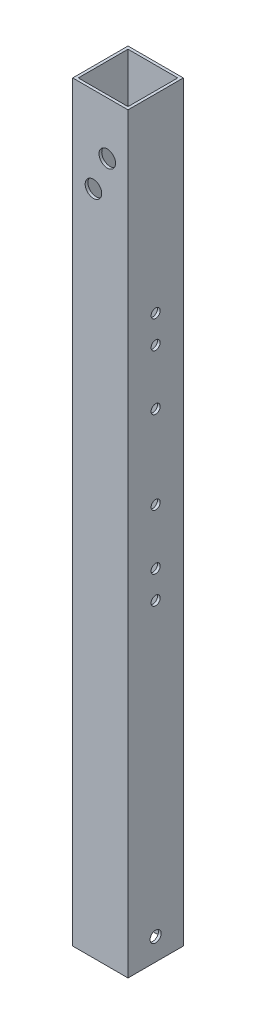
ISO-10303-21;
HEADER;
FILE_DESCRIPTION(('STEP AP214'),'2;1');
FILE_NAME('part.step','',(''),(''),'','','');
FILE_SCHEMA(('AUTOMOTIVE_DESIGN { 1 0 10303 214 1 1 1 1 }'));
ENDSEC;
DATA;
#1=APPLICATION_CONTEXT('core data for automotive mechanical design processes');
#2=APPLICATION_PROTOCOL_DEFINITION('international standard','automotive_design',2000,#1);
#3=PRODUCT_CONTEXT('',#1,'mechanical');
#4=PRODUCT('Part','Part','',(#3));
#5=PRODUCT_RELATED_PRODUCT_CATEGORY('part','',(#4));
#6=PRODUCT_DEFINITION_FORMATION('','',#4);
#7=PRODUCT_DEFINITION_CONTEXT('part definition',#1,'design');
#8=PRODUCT_DEFINITION('design','',#6,#7);
#9=PRODUCT_DEFINITION_SHAPE('','',#8);
#10=(LENGTH_UNIT() NAMED_UNIT(*) SI_UNIT(.MILLI.,.METRE.));
#11=(NAMED_UNIT(*) PLANE_ANGLE_UNIT() SI_UNIT($,.RADIAN.));
#12=(NAMED_UNIT(*) SI_UNIT($,.STERADIAN.) SOLID_ANGLE_UNIT());
#13=UNCERTAINTY_MEASURE_WITH_UNIT(LENGTH_MEASURE(1.E-05),#10,'distance_accuracy_value','');
#14=(GEOMETRIC_REPRESENTATION_CONTEXT(3) GLOBAL_UNCERTAINTY_ASSIGNED_CONTEXT((#13)) GLOBAL_UNIT_ASSIGNED_CONTEXT((#10,
#11,#12)) REPRESENTATION_CONTEXT('',''));
#15=CARTESIAN_POINT('',(0.,0.,0.));
#16=DIRECTION('',(0.,0.,1.));
#17=DIRECTION('',(1.,0.,0.));
#18=AXIS2_PLACEMENT_3D('',#15,#16,#17);
#19=CARTESIAN_POINT('',(0.,136.,0.));
#20=DIRECTION('',(0.,1.,0.));
#21=DIRECTION('',(0.,0.,1.));
#22=AXIS2_PLACEMENT_3D('',#19,#20,#21);
#23=PLANE('',#22);
#24=DIRECTION('',(0.,0.,-1.));
#25=VECTOR('',#24,1.);
#26=CARTESIAN_POINT('',(10.,136.,-10.));
#27=LINE('',#26,#25);
#28=CARTESIAN_POINT('',(10.,136.,10.));
#29=VERTEX_POINT('',#28);
#30=CARTESIAN_POINT('',(10.,136.,-10.));
#31=VERTEX_POINT('',#30);
#32=EDGE_CURVE('E146',#29,#31,#27,.T.);
#33=ORIENTED_EDGE('',*,*,#32,.T.);
#34=DIRECTION('',(-1.,0.,0.));
#35=VECTOR('',#34,1.);
#36=CARTESIAN_POINT('',(-10.,136.,-10.));
#37=LINE('',#36,#35);
#38=CARTESIAN_POINT('',(-10.,136.,-10.));
#39=VERTEX_POINT('',#38);
#40=EDGE_CURVE('E149',#31,#39,#37,.T.);
#41=ORIENTED_EDGE('',*,*,#40,.T.);
#42=DIRECTION('',(0.,0.,1.));
#43=VECTOR('',#42,1.);
#44=CARTESIAN_POINT('',(-10.,136.,-10.));
#45=LINE('',#44,#43);
#46=CARTESIAN_POINT('',(-10.,136.,10.));
#47=VERTEX_POINT('',#46);
#48=EDGE_CURVE('E152',#39,#47,#45,.T.);
#49=ORIENTED_EDGE('',*,*,#48,.T.);
#50=DIRECTION('',(1.,0.,0.));
#51=VECTOR('',#50,1.);
#52=CARTESIAN_POINT('',(-10.,136.,10.));
#53=LINE('',#52,#51);
#54=EDGE_CURVE('E154',#47,#29,#53,.T.);
#55=ORIENTED_EDGE('',*,*,#54,.T.);
#56=EDGE_LOOP('',(#33,#41,#49,#55));
#57=FACE_BOUND('',#56,.T.);
#58=DIRECTION('',(-1.,0.,0.));
#59=VECTOR('',#58,1.);
#60=CARTESIAN_POINT('',(-9.,136.,-9.));
#61=LINE('',#60,#59);
#62=CARTESIAN_POINT('',(9.,136.,-9.));
#63=VERTEX_POINT('',#62);
#64=CARTESIAN_POINT('',(-9.,136.,-9.));
#65=VERTEX_POINT('',#64);
#66=EDGE_CURVE('E116',#63,#65,#61,.T.);
#67=ORIENTED_EDGE('',*,*,#66,.F.);
#68=DIRECTION('',(0.,0.,-1.));
#69=VECTOR('',#68,1.);
#70=CARTESIAN_POINT('',(9.,136.,-9.));
#71=LINE('',#70,#69);
#72=CARTESIAN_POINT('',(9.,136.,9.));
#73=VERTEX_POINT('',#72);
#74=EDGE_CURVE('E108',#73,#63,#71,.T.);
#75=ORIENTED_EDGE('',*,*,#74,.F.);
#76=DIRECTION('',(1.,0.,0.));
#77=VECTOR('',#76,1.);
#78=CARTESIAN_POINT('',(-9.,136.,9.));
#79=LINE('',#78,#77);
#80=CARTESIAN_POINT('',(-9.,136.,9.));
#81=VERTEX_POINT('',#80);
#82=EDGE_CURVE('E130',#81,#73,#79,.T.);
#83=ORIENTED_EDGE('',*,*,#82,.F.);
#84=DIRECTION('',(0.,0.,1.));
#85=VECTOR('',#84,1.);
#86=CARTESIAN_POINT('',(-9.,136.,-9.));
#87=LINE('',#86,#85);
#88=EDGE_CURVE('E128',#65,#81,#87,.T.);
#89=ORIENTED_EDGE('',*,*,#88,.F.);
#90=EDGE_LOOP('',(#67,#75,#83,#89));
#91=FACE_BOUND('',#90,.T.);
#92=ADVANCED_FACE('F41',(#57,#91),#23,.T.);
#93=CARTESIAN_POINT('',(0.,-136.,0.));
#94=DIRECTION('',(0.,1.,0.));
#95=DIRECTION('',(0.,0.,1.));
#96=AXIS2_PLACEMENT_3D('',#93,#94,#95);
#97=PLANE('',#96);
#98=DIRECTION('',(0.,0.,-1.));
#99=VECTOR('',#98,1.);
#100=CARTESIAN_POINT('',(10.,-136.,-10.));
#101=LINE('',#100,#99);
#102=CARTESIAN_POINT('',(10.,-136.,10.));
#103=VERTEX_POINT('',#102);
#104=CARTESIAN_POINT('',(10.,-136.,-10.));
#105=VERTEX_POINT('',#104);
#106=EDGE_CURVE('E124',#103,#105,#101,.T.);
#107=ORIENTED_EDGE('',*,*,#106,.F.);
#108=DIRECTION('',(1.,0.,0.));
#109=VECTOR('',#108,1.);
#110=CARTESIAN_POINT('',(-10.,-136.,10.));
#111=LINE('',#110,#109);
#112=CARTESIAN_POINT('',(-10.,-136.,10.));
#113=VERTEX_POINT('',#112);
#114=EDGE_CURVE('E150',#113,#103,#111,.T.);
#115=ORIENTED_EDGE('',*,*,#114,.F.);
#116=DIRECTION('',(0.,0.,1.));
#117=VECTOR('',#116,1.);
#118=CARTESIAN_POINT('',(-10.,-136.,-10.));
#119=LINE('',#118,#117);
#120=CARTESIAN_POINT('',(-10.,-136.,-10.));
#121=VERTEX_POINT('',#120);
#122=EDGE_CURVE('E161',#121,#113,#119,.T.);
#123=ORIENTED_EDGE('',*,*,#122,.F.);
#124=DIRECTION('',(-1.,0.,0.));
#125=VECTOR('',#124,1.);
#126=CARTESIAN_POINT('',(-10.,-136.,-10.));
#127=LINE('',#126,#125);
#128=EDGE_CURVE('E159',#105,#121,#127,.T.);
#129=ORIENTED_EDGE('',*,*,#128,.F.);
#130=EDGE_LOOP('',(#107,#115,#123,#129));
#131=FACE_BOUND('',#130,.T.);
#132=DIRECTION('',(0.,0.,-1.));
#133=VECTOR('',#132,1.);
#134=CARTESIAN_POINT('',(9.,-136.,-9.));
#135=LINE('',#134,#133);
#136=CARTESIAN_POINT('',(9.,-136.,9.));
#137=VERTEX_POINT('',#136);
#138=CARTESIAN_POINT('',(9.,-136.,-9.));
#139=VERTEX_POINT('',#138);
#140=EDGE_CURVE('E66',#137,#139,#135,.T.);
#141=ORIENTED_EDGE('',*,*,#140,.T.);
#142=DIRECTION('',(-1.,0.,0.));
#143=VECTOR('',#142,1.);
#144=CARTESIAN_POINT('',(-9.,-136.,-9.));
#145=LINE('',#144,#143);
#146=CARTESIAN_POINT('',(-9.,-136.,-9.));
#147=VERTEX_POINT('',#146);
#148=EDGE_CURVE('E123',#139,#147,#145,.T.);
#149=ORIENTED_EDGE('',*,*,#148,.T.);
#150=DIRECTION('',(0.,0.,1.));
#151=VECTOR('',#150,1.);
#152=CARTESIAN_POINT('',(-9.,-136.,-9.));
#153=LINE('',#152,#151);
#154=CARTESIAN_POINT('',(-9.,-136.,9.));
#155=VERTEX_POINT('',#154);
#156=EDGE_CURVE('E138',#147,#155,#153,.T.);
#157=ORIENTED_EDGE('',*,*,#156,.T.);
#158=DIRECTION('',(1.,0.,0.));
#159=VECTOR('',#158,1.);
#160=CARTESIAN_POINT('',(-9.,-136.,9.));
#161=LINE('',#160,#159);
#162=EDGE_CURVE('E117',#155,#137,#161,.T.);
#163=ORIENTED_EDGE('',*,*,#162,.T.);
#164=EDGE_LOOP('',(#141,#149,#157,#163));
#165=FACE_BOUND('',#164,.T.);
#166=ADVANCED_FACE('F257',(#131,#165),#97,.F.);
#167=CARTESIAN_POINT('',(10.,136.,-10.));
#168=DIRECTION('',(-1.,0.,0.));
#169=DIRECTION('',(0.,0.,1.));
#170=AXIS2_PLACEMENT_3D('',#167,#168,#169);
#171=PLANE('',#170);
#172=CARTESIAN_POINT('',(10.,-128.,0.));
#173=DIRECTION('',(-1.,0.,0.));
#174=DIRECTION('',(0.,0.,1.));
#175=AXIS2_PLACEMENT_3D('',#172,#173,#174);
#176=CIRCLE('',#175,2.);
#177=CARTESIAN_POINT('',(10.,-128.,2.));
#178=VERTEX_POINT('',#177);
#179=EDGE_CURVE('E185',#178,#178,#176,.T.);
#180=ORIENTED_EDGE('',*,*,#179,.T.);
#181=EDGE_LOOP('',(#180));
#182=FACE_BOUND('',#181,.T.);
#183=CARTESIAN_POINT('',(10.,7.28632310015266,0.));
#184=DIRECTION('',(-1.,0.,0.));
#185=DIRECTION('',(0.,0.,1.));
#186=AXIS2_PLACEMENT_3D('',#183,#184,#185);
#187=CIRCLE('',#186,1.65);
#188=CARTESIAN_POINT('',(10.,7.28632310015266,1.65000000000001));
#189=VERTEX_POINT('',#188);
#190=EDGE_CURVE('E287',#189,#189,#187,.T.);
#191=ORIENTED_EDGE('',*,*,#190,.T.);
#192=EDGE_LOOP('',(#191));
#193=FACE_BOUND('',#192,.T.);
#194=CARTESIAN_POINT('',(10.,37.2863231001527,0.));
#195=DIRECTION('',(-1.,0.,0.));
#196=DIRECTION('',(0.,0.,1.));
#197=AXIS2_PLACEMENT_3D('',#194,#195,#196);
#198=CIRCLE('',#197,1.65);
#199=CARTESIAN_POINT('',(10.,37.2863231001527,1.65));
#200=VERTEX_POINT('',#199);
#201=EDGE_CURVE('E291',#200,#200,#198,.T.);
#202=ORIENTED_EDGE('',*,*,#201,.T.);
#203=EDGE_LOOP('',(#202));
#204=FACE_BOUND('',#203,.T.);
#205=CARTESIAN_POINT('',(10.,-22.7136768998473,0.));
#206=DIRECTION('',(-1.,0.,0.));
#207=DIRECTION('',(0.,0.,1.));
#208=AXIS2_PLACEMENT_3D('',#205,#206,#207);
#209=CIRCLE('',#208,1.65);
#210=CARTESIAN_POINT('',(10.,-22.7136768998473,1.65));
#211=VERTEX_POINT('',#210);
#212=EDGE_CURVE('E295',#211,#211,#209,.T.);
#213=ORIENTED_EDGE('',*,*,#212,.T.);
#214=EDGE_LOOP('',(#213));
#215=FACE_BOUND('',#214,.T.);
#216=CARTESIAN_POINT('',(10.,-12.7136768998473,0.));
#217=DIRECTION('',(-1.,0.,0.));
#218=DIRECTION('',(0.,0.,1.));
#219=AXIS2_PLACEMENT_3D('',#216,#217,#218);
#220=CIRCLE('',#219,1.65);
#221=CARTESIAN_POINT('',(10.,-12.7136768998473,1.65));
#222=VERTEX_POINT('',#221);
#223=EDGE_CURVE('E299',#222,#222,#220,.T.);
#224=ORIENTED_EDGE('',*,*,#223,.T.);
#225=EDGE_LOOP('',(#224));
#226=FACE_BOUND('',#225,.T.);
#227=CARTESIAN_POINT('',(10.,67.2863231001527,0.));
#228=DIRECTION('',(-1.,0.,0.));
#229=DIRECTION('',(0.,0.,1.));
#230=AXIS2_PLACEMENT_3D('',#227,#228,#229);
#231=CIRCLE('',#230,1.65);
#232=CARTESIAN_POINT('',(10.,67.2863231001527,1.65));
#233=VERTEX_POINT('',#232);
#234=EDGE_CURVE('E303',#233,#233,#231,.T.);
#235=ORIENTED_EDGE('',*,*,#234,.T.);
#236=EDGE_LOOP('',(#235));
#237=FACE_BOUND('',#236,.T.);
#238=CARTESIAN_POINT('',(10.,57.2863231001527,0.));
#239=DIRECTION('',(-1.,0.,0.));
#240=DIRECTION('',(0.,0.,1.));
#241=AXIS2_PLACEMENT_3D('',#238,#239,#240);
#242=CIRCLE('',#241,1.65);
#243=CARTESIAN_POINT('',(10.,57.2863231001527,1.65));
#244=VERTEX_POINT('',#243);
#245=EDGE_CURVE('E307',#244,#244,#242,.T.);
#246=ORIENTED_EDGE('',*,*,#245,.T.);
#247=EDGE_LOOP('',(#246));
#248=FACE_BOUND('',#247,.T.);
#249=ORIENTED_EDGE('',*,*,#106,.T.);
#250=DIRECTION('',(0.,-1.,0.));
#251=VECTOR('',#250,1.);
#252=CARTESIAN_POINT('',(10.,136.,-10.));
#253=LINE('',#252,#251);
#254=EDGE_CURVE('E11',#31,#105,#253,.T.);
#255=ORIENTED_EDGE('',*,*,#254,.F.);
#256=ORIENTED_EDGE('',*,*,#32,.F.);
#257=DIRECTION('',(0.,-1.,0.));
#258=VECTOR('',#257,1.);
#259=CARTESIAN_POINT('',(10.,136.,10.));
#260=LINE('',#259,#258);
#261=EDGE_CURVE('E156',#29,#103,#260,.T.);
#262=ORIENTED_EDGE('',*,*,#261,.T.);
#263=EDGE_LOOP('',(#249,#255,#256,#262));
#264=FACE_BOUND('',#263,.T.);
#265=ADVANCED_FACE('F43',(#182,#193,#204,#215,#226,#237,#248,#264),#171,.F.);
#266=CARTESIAN_POINT('',(-10.,136.,-10.));
#267=DIRECTION('',(0.,0.,1.));
#268=DIRECTION('',(1.,0.,0.));
#269=AXIS2_PLACEMENT_3D('',#266,#267,#268);
#270=PLANE('',#269);
#271=CARTESIAN_POINT('',(-2.5,105.,-10.));
#272=DIRECTION('',(0.,0.,1.));
#273=DIRECTION('',(1.,0.,0.));
#274=AXIS2_PLACEMENT_3D('',#271,#272,#273);
#275=CIRCLE('',#274,3.);
#276=CARTESIAN_POINT('',(0.500000000000003,105.,-10.));
#277=VERTEX_POINT('',#276);
#278=EDGE_CURVE('E136',#277,#277,#275,.T.);
#279=ORIENTED_EDGE('',*,*,#278,.T.);
#280=EDGE_LOOP('',(#279));
#281=FACE_BOUND('',#280,.T.);
#282=CARTESIAN_POINT('',(2.5,117.,-10.));
#283=DIRECTION('',(0.,0.,1.));
#284=DIRECTION('',(1.,0.,0.));
#285=AXIS2_PLACEMENT_3D('',#282,#283,#284);
#286=CIRCLE('',#285,3.);
#287=CARTESIAN_POINT('',(5.5,117.,-10.));
#288=VERTEX_POINT('',#287);
#289=EDGE_CURVE('E180',#288,#288,#286,.T.);
#290=ORIENTED_EDGE('',*,*,#289,.T.);
#291=EDGE_LOOP('',(#290));
#292=FACE_BOUND('',#291,.T.);
#293=ORIENTED_EDGE('',*,*,#128,.T.);
#294=DIRECTION('',(0.,-1.,0.));
#295=VECTOR('',#294,1.);
#296=CARTESIAN_POINT('',(-10.,136.,-10.));
#297=LINE('',#296,#295);
#298=EDGE_CURVE('E50',#39,#121,#297,.T.);
#299=ORIENTED_EDGE('',*,*,#298,.F.);
#300=ORIENTED_EDGE('',*,*,#40,.F.);
#301=ORIENTED_EDGE('',*,*,#254,.T.);
#302=EDGE_LOOP('',(#293,#299,#300,#301));
#303=FACE_BOUND('',#302,.T.);
#304=ADVANCED_FACE('F231',(#281,#292,#303),#270,.F.);
#305=CARTESIAN_POINT('',(-10.,136.,-10.));
#306=DIRECTION('',(1.,0.,0.));
#307=DIRECTION('',(0.,0.,-1.));
#308=AXIS2_PLACEMENT_3D('',#305,#306,#307);
#309=PLANE('',#308);
#310=CARTESIAN_POINT('',(-10.,-128.,0.));
#311=DIRECTION('',(-1.,0.,0.));
#312=DIRECTION('',(0.,0.,1.));
#313=AXIS2_PLACEMENT_3D('',#310,#311,#312);
#314=CIRCLE('',#313,2.);
#315=CARTESIAN_POINT('',(-10.,-128.,2.));
#316=VERTEX_POINT('',#315);
#317=EDGE_CURVE('E394',#316,#316,#314,.T.);
#318=ORIENTED_EDGE('',*,*,#317,.F.);
#319=EDGE_LOOP('',(#318));
#320=FACE_BOUND('',#319,.T.);
#321=CARTESIAN_POINT('',(-10.,7.28632310015266,0.));
#322=DIRECTION('',(-1.,0.,0.));
#323=DIRECTION('',(0.,0.,1.));
#324=AXIS2_PLACEMENT_3D('',#321,#322,#323);
#325=CIRCLE('',#324,1.65);
#326=CARTESIAN_POINT('',(-10.,7.28632310015266,1.65000000000001));
#327=VERTEX_POINT('',#326);
#328=EDGE_CURVE('E396',#327,#327,#325,.T.);
#329=ORIENTED_EDGE('',*,*,#328,.F.);
#330=EDGE_LOOP('',(#329));
#331=FACE_BOUND('',#330,.T.);
#332=CARTESIAN_POINT('',(-10.,37.2863231001527,0.));
#333=DIRECTION('',(-1.,0.,0.));
#334=DIRECTION('',(0.,0.,1.));
#335=AXIS2_PLACEMENT_3D('',#332,#333,#334);
#336=CIRCLE('',#335,1.65);
#337=CARTESIAN_POINT('',(-10.,37.2863231001527,1.65));
#338=VERTEX_POINT('',#337);
#339=EDGE_CURVE('E400',#338,#338,#336,.T.);
#340=ORIENTED_EDGE('',*,*,#339,.F.);
#341=EDGE_LOOP('',(#340));
#342=FACE_BOUND('',#341,.T.);
#343=CARTESIAN_POINT('',(-10.,-22.7136768998473,0.));
#344=DIRECTION('',(-1.,0.,0.));
#345=DIRECTION('',(0.,0.,1.));
#346=AXIS2_PLACEMENT_3D('',#343,#344,#345);
#347=CIRCLE('',#346,1.65);
#348=CARTESIAN_POINT('',(-10.,-22.7136768998473,1.65));
#349=VERTEX_POINT('',#348);
#350=EDGE_CURVE('E380',#349,#349,#347,.T.);
#351=ORIENTED_EDGE('',*,*,#350,.F.);
#352=EDGE_LOOP('',(#351));
#353=FACE_BOUND('',#352,.T.);
#354=CARTESIAN_POINT('',(-10.,-12.7136768998473,0.));
#355=DIRECTION('',(-1.,0.,0.));
#356=DIRECTION('',(0.,0.,1.));
#357=AXIS2_PLACEMENT_3D('',#354,#355,#356);
#358=CIRCLE('',#357,1.65);
#359=CARTESIAN_POINT('',(-10.,-12.7136768998473,1.65));
#360=VERTEX_POINT('',#359);
#361=EDGE_CURVE('E379',#360,#360,#358,.T.);
#362=ORIENTED_EDGE('',*,*,#361,.F.);
#363=EDGE_LOOP('',(#362));
#364=FACE_BOUND('',#363,.T.);
#365=CARTESIAN_POINT('',(-10.,67.2863231001527,0.));
#366=DIRECTION('',(-1.,0.,0.));
#367=DIRECTION('',(0.,0.,1.));
#368=AXIS2_PLACEMENT_3D('',#365,#366,#367);
#369=CIRCLE('',#368,1.65);
#370=CARTESIAN_POINT('',(-10.,67.2863231001527,1.65));
#371=VERTEX_POINT('',#370);
#372=EDGE_CURVE('E387',#371,#371,#369,.T.);
#373=ORIENTED_EDGE('',*,*,#372,.F.);
#374=EDGE_LOOP('',(#373));
#375=FACE_BOUND('',#374,.T.);
#376=CARTESIAN_POINT('',(-10.,57.2863231001527,0.));
#377=DIRECTION('',(-1.,0.,0.));
#378=DIRECTION('',(0.,0.,1.));
#379=AXIS2_PLACEMENT_3D('',#376,#377,#378);
#380=CIRCLE('',#379,1.65);
#381=CARTESIAN_POINT('',(-10.,57.2863231001527,1.65));
#382=VERTEX_POINT('',#381);
#383=EDGE_CURVE('E391',#382,#382,#380,.T.);
#384=ORIENTED_EDGE('',*,*,#383,.F.);
#385=EDGE_LOOP('',(#384));
#386=FACE_BOUND('',#385,.T.);
#387=ORIENTED_EDGE('',*,*,#122,.T.);
#388=DIRECTION('',(0.,-1.,0.));
#389=VECTOR('',#388,1.);
#390=CARTESIAN_POINT('',(-10.,136.,10.));
#391=LINE('',#390,#389);
#392=EDGE_CURVE('E166',#47,#113,#391,.T.);
#393=ORIENTED_EDGE('',*,*,#392,.F.);
#394=ORIENTED_EDGE('',*,*,#48,.F.);
#395=ORIENTED_EDGE('',*,*,#298,.T.);
#396=EDGE_LOOP('',(#387,#393,#394,#395));
#397=FACE_BOUND('',#396,.T.);
#398=ADVANCED_FACE('F271',(#320,#331,#342,#353,#364,#375,#386,#397),#309,.F.);
#399=CARTESIAN_POINT('',(-10.,136.,10.));
#400=DIRECTION('',(0.,0.,-1.));
#401=DIRECTION('',(-1.,0.,0.));
#402=AXIS2_PLACEMENT_3D('',#399,#400,#401);
#403=PLANE('',#402);
#404=CARTESIAN_POINT('',(-2.5,105.,10.));
#405=DIRECTION('',(0.,0.,1.));
#406=DIRECTION('',(1.,0.,0.));
#407=AXIS2_PLACEMENT_3D('',#404,#405,#406);
#408=CIRCLE('',#407,3.);
#409=CARTESIAN_POINT('',(0.500000000000003,105.,10.));
#410=VERTEX_POINT('',#409);
#411=EDGE_CURVE('E175',#410,#410,#408,.T.);
#412=ORIENTED_EDGE('',*,*,#411,.F.);
#413=EDGE_LOOP('',(#412));
#414=FACE_BOUND('',#413,.T.);
#415=CARTESIAN_POINT('',(2.5,117.,10.));
#416=DIRECTION('',(0.,0.,1.));
#417=DIRECTION('',(1.,0.,0.));
#418=AXIS2_PLACEMENT_3D('',#415,#416,#417);
#419=CIRCLE('',#418,3.);
#420=CARTESIAN_POINT('',(5.5,117.,10.));
#421=VERTEX_POINT('',#420);
#422=EDGE_CURVE('E218',#421,#421,#419,.T.);
#423=ORIENTED_EDGE('',*,*,#422,.F.);
#424=EDGE_LOOP('',(#423));
#425=FACE_BOUND('',#424,.T.);
#426=ORIENTED_EDGE('',*,*,#114,.T.);
#427=ORIENTED_EDGE('',*,*,#261,.F.);
#428=ORIENTED_EDGE('',*,*,#54,.F.);
#429=ORIENTED_EDGE('',*,*,#392,.T.);
#430=EDGE_LOOP('',(#426,#427,#428,#429));
#431=FACE_BOUND('',#430,.T.);
#432=ADVANCED_FACE('F268',(#414,#425,#431),#403,.F.);
#433=CARTESIAN_POINT('',(9.,136.,-9.));
#434=DIRECTION('',(-1.,0.,0.));
#435=DIRECTION('',(0.,0.,1.));
#436=AXIS2_PLACEMENT_3D('',#433,#434,#435);
#437=PLANE('',#436);
#438=CARTESIAN_POINT('',(9.,-128.,0.));
#439=DIRECTION('',(-1.,0.,0.));
#440=DIRECTION('',(0.,0.,1.));
#441=AXIS2_PLACEMENT_3D('',#438,#439,#440);
#442=CIRCLE('',#441,2.);
#443=CARTESIAN_POINT('',(9.,-128.,2.));
#444=VERTEX_POINT('',#443);
#445=EDGE_CURVE('E215',#444,#444,#442,.T.);
#446=ORIENTED_EDGE('',*,*,#445,.F.);
#447=EDGE_LOOP('',(#446));
#448=FACE_BOUND('',#447,.T.);
#449=CARTESIAN_POINT('',(9.,7.28632310015266,0.));
#450=DIRECTION('',(-1.,0.,0.));
#451=DIRECTION('',(0.,0.,1.));
#452=AXIS2_PLACEMENT_3D('',#449,#450,#451);
#453=CIRCLE('',#452,1.65);
#454=CARTESIAN_POINT('',(9.,7.28632310015266,1.65000000000001));
#455=VERTEX_POINT('',#454);
#456=EDGE_CURVE('E203',#455,#455,#453,.T.);
#457=ORIENTED_EDGE('',*,*,#456,.F.);
#458=EDGE_LOOP('',(#457));
#459=FACE_BOUND('',#458,.T.);
#460=CARTESIAN_POINT('',(9.,37.2863231001527,0.));
#461=DIRECTION('',(-1.,0.,0.));
#462=DIRECTION('',(0.,0.,1.));
#463=AXIS2_PLACEMENT_3D('',#460,#461,#462);
#464=CIRCLE('',#463,1.65);
#465=CARTESIAN_POINT('',(9.,37.2863231001527,1.65));
#466=VERTEX_POINT('',#465);
#467=EDGE_CURVE('E200',#466,#466,#464,.T.);
#468=ORIENTED_EDGE('',*,*,#467,.F.);
#469=EDGE_LOOP('',(#468));
#470=FACE_BOUND('',#469,.T.);
#471=CARTESIAN_POINT('',(9.,-22.7136768998473,0.));
#472=DIRECTION('',(-1.,0.,0.));
#473=DIRECTION('',(0.,0.,1.));
#474=AXIS2_PLACEMENT_3D('',#471,#472,#473);
#475=CIRCLE('',#474,1.65);
#476=CARTESIAN_POINT('',(9.,-22.7136768998473,1.65));
#477=VERTEX_POINT('',#476);
#478=EDGE_CURVE('E197',#477,#477,#475,.T.);
#479=ORIENTED_EDGE('',*,*,#478,.F.);
#480=EDGE_LOOP('',(#479));
#481=FACE_BOUND('',#480,.T.);
#482=CARTESIAN_POINT('',(9.,-12.7136768998473,0.));
#483=DIRECTION('',(-1.,0.,0.));
#484=DIRECTION('',(0.,0.,1.));
#485=AXIS2_PLACEMENT_3D('',#482,#483,#484);
#486=CIRCLE('',#485,1.65);
#487=CARTESIAN_POINT('',(9.,-12.7136768998473,1.65));
#488=VERTEX_POINT('',#487);
#489=EDGE_CURVE('E193',#488,#488,#486,.T.);
#490=ORIENTED_EDGE('',*,*,#489,.F.);
#491=EDGE_LOOP('',(#490));
#492=FACE_BOUND('',#491,.T.);
#493=CARTESIAN_POINT('',(9.,67.2863231001527,0.));
#494=DIRECTION('',(-1.,0.,0.));
#495=DIRECTION('',(0.,0.,1.));
#496=AXIS2_PLACEMENT_3D('',#493,#494,#495);
#497=CIRCLE('',#496,1.65);
#498=CARTESIAN_POINT('',(9.,67.2863231001527,1.65));
#499=VERTEX_POINT('',#498);
#500=EDGE_CURVE('E189',#499,#499,#497,.T.);
#501=ORIENTED_EDGE('',*,*,#500,.F.);
#502=EDGE_LOOP('',(#501));
#503=FACE_BOUND('',#502,.T.);
#504=CARTESIAN_POINT('',(9.,57.2863231001527,0.));
#505=DIRECTION('',(-1.,0.,0.));
#506=DIRECTION('',(0.,0.,1.));
#507=AXIS2_PLACEMENT_3D('',#504,#505,#506);
#508=CIRCLE('',#507,1.65);
#509=CARTESIAN_POINT('',(9.,57.2863231001527,1.65));
#510=VERTEX_POINT('',#509);
#511=EDGE_CURVE('E184',#510,#510,#508,.T.);
#512=ORIENTED_EDGE('',*,*,#511,.F.);
#513=EDGE_LOOP('',(#512));
#514=FACE_BOUND('',#513,.T.);
#515=ORIENTED_EDGE('',*,*,#140,.F.);
#516=DIRECTION('',(0.,-1.,0.));
#517=VECTOR('',#516,1.);
#518=CARTESIAN_POINT('',(9.,136.,9.));
#519=LINE('',#518,#517);
#520=EDGE_CURVE('E112',#73,#137,#519,.T.);
#521=ORIENTED_EDGE('',*,*,#520,.F.);
#522=ORIENTED_EDGE('',*,*,#74,.T.);
#523=DIRECTION('',(0.,-1.,0.));
#524=VECTOR('',#523,1.);
#525=CARTESIAN_POINT('',(9.,136.,-9.));
#526=LINE('',#525,#524);
#527=EDGE_CURVE('E111',#63,#139,#526,.T.);
#528=ORIENTED_EDGE('',*,*,#527,.T.);
#529=EDGE_LOOP('',(#515,#521,#522,#528));
#530=FACE_BOUND('',#529,.T.);
#531=ADVANCED_FACE('F110',(#448,#459,#470,#481,#492,#503,#514,#530),#437,.T.);
#532=CARTESIAN_POINT('',(-9.,136.,-9.));
#533=DIRECTION('',(0.,0.,1.));
#534=DIRECTION('',(1.,0.,0.));
#535=AXIS2_PLACEMENT_3D('',#532,#533,#534);
#536=PLANE('',#535);
#537=CARTESIAN_POINT('',(-2.5,105.,-9.00000000000001));
#538=DIRECTION('',(0.,0.,1.));
#539=DIRECTION('',(1.,0.,0.));
#540=AXIS2_PLACEMENT_3D('',#537,#538,#539);
#541=CIRCLE('',#540,3.);
#542=CARTESIAN_POINT('',(0.500000000000003,105.,-9.00000000000001));
#543=VERTEX_POINT('',#542);
#544=EDGE_CURVE('E179',#543,#543,#541,.T.);
#545=ORIENTED_EDGE('',*,*,#544,.F.);
#546=EDGE_LOOP('',(#545));
#547=FACE_BOUND('',#546,.T.);
#548=CARTESIAN_POINT('',(2.5,117.,-9.00000000000001));
#549=DIRECTION('',(0.,0.,1.));
#550=DIRECTION('',(1.,0.,0.));
#551=AXIS2_PLACEMENT_3D('',#548,#549,#550);
#552=CIRCLE('',#551,3.);
#553=CARTESIAN_POINT('',(5.5,117.,-9.00000000000001));
#554=VERTEX_POINT('',#553);
#555=EDGE_CURVE('E174',#554,#554,#552,.T.);
#556=ORIENTED_EDGE('',*,*,#555,.F.);
#557=EDGE_LOOP('',(#556));
#558=FACE_BOUND('',#557,.T.);
#559=ORIENTED_EDGE('',*,*,#148,.F.);
#560=ORIENTED_EDGE('',*,*,#527,.F.);
#561=ORIENTED_EDGE('',*,*,#66,.T.);
#562=DIRECTION('',(0.,-1.,0.));
#563=VECTOR('',#562,1.);
#564=CARTESIAN_POINT('',(-9.,136.,-9.));
#565=LINE('',#564,#563);
#566=EDGE_CURVE('E125',#65,#147,#565,.T.);
#567=ORIENTED_EDGE('',*,*,#566,.T.);
#568=EDGE_LOOP('',(#559,#560,#561,#567));
#569=FACE_BOUND('',#568,.T.);
#570=ADVANCED_FACE('F120',(#547,#558,#569),#536,.T.);
#571=CARTESIAN_POINT('',(-9.,136.,-9.));
#572=DIRECTION('',(1.,0.,0.));
#573=DIRECTION('',(0.,0.,-1.));
#574=AXIS2_PLACEMENT_3D('',#571,#572,#573);
#575=PLANE('',#574);
#576=CARTESIAN_POINT('',(-9.,-128.,0.));
#577=DIRECTION('',(1.,0.,0.));
#578=DIRECTION('',(0.,0.,-1.));
#579=AXIS2_PLACEMENT_3D('',#576,#577,#578);
#580=CIRCLE('',#579,2.);
#581=CARTESIAN_POINT('',(-9.,-128.,-2.));
#582=VERTEX_POINT('',#581);
#583=EDGE_CURVE('E45',#582,#582,#580,.T.);
#584=ORIENTED_EDGE('',*,*,#583,.F.);
#585=EDGE_LOOP('',(#584));
#586=FACE_BOUND('',#585,.T.);
#587=CARTESIAN_POINT('',(-9.,7.28632310015266,0.));
#588=DIRECTION('',(1.,0.,0.));
#589=DIRECTION('',(0.,0.,-1.));
#590=AXIS2_PLACEMENT_3D('',#587,#588,#589);
#591=CIRCLE('',#590,1.65);
#592=CARTESIAN_POINT('',(-9.,7.28632310015266,-1.64999999999999));
#593=VERTEX_POINT('',#592);
#594=EDGE_CURVE('E201',#593,#593,#591,.T.);
#595=ORIENTED_EDGE('',*,*,#594,.F.);
#596=EDGE_LOOP('',(#595));
#597=FACE_BOUND('',#596,.T.);
#598=CARTESIAN_POINT('',(-9.,37.2863231001527,0.));
#599=DIRECTION('',(1.,0.,0.));
#600=DIRECTION('',(0.,0.,-1.));
#601=AXIS2_PLACEMENT_3D('',#598,#599,#600);
#602=CIRCLE('',#601,1.65);
#603=CARTESIAN_POINT('',(-9.,37.2863231001527,-1.65));
#604=VERTEX_POINT('',#603);
#605=EDGE_CURVE('E198',#604,#604,#602,.T.);
#606=ORIENTED_EDGE('',*,*,#605,.F.);
#607=EDGE_LOOP('',(#606));
#608=FACE_BOUND('',#607,.T.);
#609=CARTESIAN_POINT('',(-9.,-22.7136768998473,0.));
#610=DIRECTION('',(1.,0.,0.));
#611=DIRECTION('',(0.,0.,-1.));
#612=AXIS2_PLACEMENT_3D('',#609,#610,#611);
#613=CIRCLE('',#612,1.65);
#614=CARTESIAN_POINT('',(-9.,-22.7136768998473,-1.65));
#615=VERTEX_POINT('',#614);
#616=EDGE_CURVE('E194',#615,#615,#613,.T.);
#617=ORIENTED_EDGE('',*,*,#616,.F.);
#618=EDGE_LOOP('',(#617));
#619=FACE_BOUND('',#618,.T.);
#620=CARTESIAN_POINT('',(-9.,-12.7136768998473,0.));
#621=DIRECTION('',(1.,0.,0.));
#622=DIRECTION('',(0.,0.,-1.));
#623=AXIS2_PLACEMENT_3D('',#620,#621,#622);
#624=CIRCLE('',#623,1.65);
#625=CARTESIAN_POINT('',(-9.,-12.7136768998473,-1.65));
#626=VERTEX_POINT('',#625);
#627=EDGE_CURVE('E190',#626,#626,#624,.T.);
#628=ORIENTED_EDGE('',*,*,#627,.F.);
#629=EDGE_LOOP('',(#628));
#630=FACE_BOUND('',#629,.T.);
#631=CARTESIAN_POINT('',(-9.,67.2863231001527,0.));
#632=DIRECTION('',(1.,0.,0.));
#633=DIRECTION('',(0.,0.,-1.));
#634=AXIS2_PLACEMENT_3D('',#631,#632,#633);
#635=CIRCLE('',#634,1.65);
#636=CARTESIAN_POINT('',(-9.,67.2863231001527,-1.65));
#637=VERTEX_POINT('',#636);
#638=EDGE_CURVE('E186',#637,#637,#635,.T.);
#639=ORIENTED_EDGE('',*,*,#638,.F.);
#640=EDGE_LOOP('',(#639));
#641=FACE_BOUND('',#640,.T.);
#642=CARTESIAN_POINT('',(-9.,57.2863231001527,0.));
#643=DIRECTION('',(1.,0.,0.));
#644=DIRECTION('',(0.,0.,-1.));
#645=AXIS2_PLACEMENT_3D('',#642,#643,#644);
#646=CIRCLE('',#645,1.65);
#647=CARTESIAN_POINT('',(-9.,57.2863231001527,-1.65));
#648=VERTEX_POINT('',#647);
#649=EDGE_CURVE('E181',#648,#648,#646,.T.);
#650=ORIENTED_EDGE('',*,*,#649,.F.);
#651=EDGE_LOOP('',(#650));
#652=FACE_BOUND('',#651,.T.);
#653=ORIENTED_EDGE('',*,*,#156,.F.);
#654=ORIENTED_EDGE('',*,*,#566,.F.);
#655=ORIENTED_EDGE('',*,*,#88,.T.);
#656=DIRECTION('',(0.,-1.,0.));
#657=VECTOR('',#656,1.);
#658=CARTESIAN_POINT('',(-9.,136.,9.));
#659=LINE('',#658,#657);
#660=EDGE_CURVE('E58',#81,#155,#659,.T.);
#661=ORIENTED_EDGE('',*,*,#660,.T.);
#662=EDGE_LOOP('',(#653,#654,#655,#661));
#663=FACE_BOUND('',#662,.T.);
#664=ADVANCED_FACE('F325',(#586,#597,#608,#619,#630,#641,#652,#663),#575,.T.);
#665=CARTESIAN_POINT('',(-9.,136.,9.));
#666=DIRECTION('',(0.,0.,-1.));
#667=DIRECTION('',(-1.,0.,0.));
#668=AXIS2_PLACEMENT_3D('',#665,#666,#667);
#669=PLANE('',#668);
#670=CARTESIAN_POINT('',(-2.5,105.,9.00000000000001));
#671=DIRECTION('',(0.,0.,-1.));
#672=DIRECTION('',(-1.,0.,0.));
#673=AXIS2_PLACEMENT_3D('',#670,#671,#672);
#674=CIRCLE('',#673,3.);
#675=CARTESIAN_POINT('',(-5.5,105.,9.00000000000001));
#676=VERTEX_POINT('',#675);
#677=EDGE_CURVE('E176',#676,#676,#674,.T.);
#678=ORIENTED_EDGE('',*,*,#677,.F.);
#679=EDGE_LOOP('',(#678));
#680=FACE_BOUND('',#679,.T.);
#681=CARTESIAN_POINT('',(2.5,117.,9.00000000000001));
#682=DIRECTION('',(0.,0.,-1.));
#683=DIRECTION('',(-1.,0.,0.));
#684=AXIS2_PLACEMENT_3D('',#681,#682,#683);
#685=CIRCLE('',#684,3.);
#686=CARTESIAN_POINT('',(-0.500000000000006,117.,9.00000000000001));
#687=VERTEX_POINT('',#686);
#688=EDGE_CURVE('E171',#687,#687,#685,.T.);
#689=ORIENTED_EDGE('',*,*,#688,.F.);
#690=EDGE_LOOP('',(#689));
#691=FACE_BOUND('',#690,.T.);
#692=ORIENTED_EDGE('',*,*,#162,.F.);
#693=ORIENTED_EDGE('',*,*,#660,.F.);
#694=ORIENTED_EDGE('',*,*,#82,.T.);
#695=ORIENTED_EDGE('',*,*,#520,.T.);
#696=EDGE_LOOP('',(#692,#693,#694,#695));
#697=FACE_BOUND('',#696,.T.);
#698=ADVANCED_FACE('F323',(#680,#691,#697),#669,.T.);
#699=CARTESIAN_POINT('',(2.5,117.,-190.));
#700=DIRECTION('',(0.,0.,1.));
#701=DIRECTION('',(1.,0.,0.));
#702=AXIS2_PLACEMENT_3D('',#699,#700,#701);
#703=CYLINDRICAL_SURFACE('',#702,3.);
#704=ORIENTED_EDGE('',*,*,#688,.T.);
#705=EDGE_LOOP('',(#704));
#706=FACE_BOUND('',#705,.T.);
#707=ORIENTED_EDGE('',*,*,#422,.T.);
#708=EDGE_LOOP('',(#707));
#709=FACE_BOUND('',#708,.T.);
#710=ADVANCED_FACE('F252',(#706,#709),#703,.F.);
#711=CARTESIAN_POINT('',(-2.5,105.,-190.));
#712=DIRECTION('',(0.,0.,1.));
#713=DIRECTION('',(1.,0.,0.));
#714=AXIS2_PLACEMENT_3D('',#711,#712,#713);
#715=CYLINDRICAL_SURFACE('',#714,3.);
#716=ORIENTED_EDGE('',*,*,#677,.T.);
#717=EDGE_LOOP('',(#716));
#718=FACE_BOUND('',#717,.T.);
#719=ORIENTED_EDGE('',*,*,#411,.T.);
#720=EDGE_LOOP('',(#719));
#721=FACE_BOUND('',#720,.T.);
#722=ADVANCED_FACE('F240',(#718,#721),#715,.F.);
#723=ORIENTED_EDGE('',*,*,#555,.T.);
#724=EDGE_LOOP('',(#723));
#725=FACE_BOUND('',#724,.T.);
#726=ORIENTED_EDGE('',*,*,#289,.F.);
#727=EDGE_LOOP('',(#726));
#728=FACE_BOUND('',#727,.T.);
#729=ADVANCED_FACE('F237',(#725,#728),#703,.F.);
#730=ORIENTED_EDGE('',*,*,#544,.T.);
#731=EDGE_LOOP('',(#730));
#732=FACE_BOUND('',#731,.T.);
#733=ORIENTED_EDGE('',*,*,#278,.F.);
#734=EDGE_LOOP('',(#733));
#735=FACE_BOUND('',#734,.T.);
#736=ADVANCED_FACE('F234',(#732,#735),#715,.F.);
#737=CARTESIAN_POINT('',(10.,57.2863231001527,0.));
#738=DIRECTION('',(-1.,0.,0.));
#739=DIRECTION('',(0.,0.,1.));
#740=AXIS2_PLACEMENT_3D('',#737,#738,#739);
#741=CYLINDRICAL_SURFACE('',#740,1.65);
#742=ORIENTED_EDGE('',*,*,#649,.T.);
#743=EDGE_LOOP('',(#742));
#744=FACE_BOUND('',#743,.T.);
#745=ORIENTED_EDGE('',*,*,#383,.T.);
#746=EDGE_LOOP('',(#745));
#747=FACE_BOUND('',#746,.T.);
#748=ADVANCED_FACE('F236',(#744,#747),#741,.F.);
#749=CARTESIAN_POINT('',(10.,67.2863231001527,0.));
#750=DIRECTION('',(-1.,0.,0.));
#751=DIRECTION('',(0.,0.,1.));
#752=AXIS2_PLACEMENT_3D('',#749,#750,#751);
#753=CYLINDRICAL_SURFACE('',#752,1.65);
#754=ORIENTED_EDGE('',*,*,#638,.T.);
#755=EDGE_LOOP('',(#754));
#756=FACE_BOUND('',#755,.T.);
#757=ORIENTED_EDGE('',*,*,#372,.T.);
#758=EDGE_LOOP('',(#757));
#759=FACE_BOUND('',#758,.T.);
#760=ADVANCED_FACE('F246',(#756,#759),#753,.F.);
#761=CARTESIAN_POINT('',(10.,-12.7136768998473,0.));
#762=DIRECTION('',(-1.,0.,0.));
#763=DIRECTION('',(0.,0.,1.));
#764=AXIS2_PLACEMENT_3D('',#761,#762,#763);
#765=CYLINDRICAL_SURFACE('',#764,1.65);
#766=ORIENTED_EDGE('',*,*,#627,.T.);
#767=EDGE_LOOP('',(#766));
#768=FACE_BOUND('',#767,.T.);
#769=ORIENTED_EDGE('',*,*,#361,.T.);
#770=EDGE_LOOP('',(#769));
#771=FACE_BOUND('',#770,.T.);
#772=ADVANCED_FACE('F378',(#768,#771),#765,.F.);
#773=CARTESIAN_POINT('',(10.,-22.7136768998473,0.));
#774=DIRECTION('',(-1.,0.,0.));
#775=DIRECTION('',(0.,0.,1.));
#776=AXIS2_PLACEMENT_3D('',#773,#774,#775);
#777=CYLINDRICAL_SURFACE('',#776,1.65);
#778=ORIENTED_EDGE('',*,*,#616,.T.);
#779=EDGE_LOOP('',(#778));
#780=FACE_BOUND('',#779,.T.);
#781=ORIENTED_EDGE('',*,*,#350,.T.);
#782=EDGE_LOOP('',(#781));
#783=FACE_BOUND('',#782,.T.);
#784=ADVANCED_FACE('F428',(#780,#783),#777,.F.);
#785=CARTESIAN_POINT('',(10.,37.2863231001527,0.));
#786=DIRECTION('',(-1.,0.,0.));
#787=DIRECTION('',(0.,0.,1.));
#788=AXIS2_PLACEMENT_3D('',#785,#786,#787);
#789=CYLINDRICAL_SURFACE('',#788,1.65);
#790=ORIENTED_EDGE('',*,*,#605,.T.);
#791=EDGE_LOOP('',(#790));
#792=FACE_BOUND('',#791,.T.);
#793=ORIENTED_EDGE('',*,*,#339,.T.);
#794=EDGE_LOOP('',(#793));
#795=FACE_BOUND('',#794,.T.);
#796=ADVANCED_FACE('F447',(#792,#795),#789,.F.);
#797=CARTESIAN_POINT('',(10.,7.28632310015266,0.));
#798=DIRECTION('',(-1.,0.,0.));
#799=DIRECTION('',(0.,0.,1.));
#800=AXIS2_PLACEMENT_3D('',#797,#798,#799);
#801=CYLINDRICAL_SURFACE('',#800,1.65);
#802=ORIENTED_EDGE('',*,*,#594,.T.);
#803=EDGE_LOOP('',(#802));
#804=FACE_BOUND('',#803,.T.);
#805=ORIENTED_EDGE('',*,*,#328,.T.);
#806=EDGE_LOOP('',(#805));
#807=FACE_BOUND('',#806,.T.);
#808=ADVANCED_FACE('F439',(#804,#807),#801,.F.);
#809=CARTESIAN_POINT('',(10.,-128.,0.));
#810=DIRECTION('',(-1.,0.,0.));
#811=DIRECTION('',(0.,0.,1.));
#812=AXIS2_PLACEMENT_3D('',#809,#810,#811);
#813=CYLINDRICAL_SURFACE('',#812,2.);
#814=ORIENTED_EDGE('',*,*,#583,.T.);
#815=EDGE_LOOP('',(#814));
#816=FACE_BOUND('',#815,.T.);
#817=ORIENTED_EDGE('',*,*,#317,.T.);
#818=EDGE_LOOP('',(#817));
#819=FACE_BOUND('',#818,.T.);
#820=ADVANCED_FACE('F407',(#816,#819),#813,.F.);
#821=ORIENTED_EDGE('',*,*,#511,.T.);
#822=EDGE_LOOP('',(#821));
#823=FACE_BOUND('',#822,.T.);
#824=ORIENTED_EDGE('',*,*,#245,.F.);
#825=EDGE_LOOP('',(#824));
#826=FACE_BOUND('',#825,.T.);
#827=ADVANCED_FACE('F249',(#823,#826),#741,.F.);
#828=ORIENTED_EDGE('',*,*,#500,.T.);
#829=EDGE_LOOP('',(#828));
#830=FACE_BOUND('',#829,.T.);
#831=ORIENTED_EDGE('',*,*,#234,.F.);
#832=EDGE_LOOP('',(#831));
#833=FACE_BOUND('',#832,.T.);
#834=ADVANCED_FACE('F376',(#830,#833),#753,.F.);
#835=ORIENTED_EDGE('',*,*,#489,.T.);
#836=EDGE_LOOP('',(#835));
#837=FACE_BOUND('',#836,.T.);
#838=ORIENTED_EDGE('',*,*,#223,.F.);
#839=EDGE_LOOP('',(#838));
#840=FACE_BOUND('',#839,.T.);
#841=ADVANCED_FACE('F372',(#837,#840),#765,.F.);
#842=ORIENTED_EDGE('',*,*,#478,.T.);
#843=EDGE_LOOP('',(#842));
#844=FACE_BOUND('',#843,.T.);
#845=ORIENTED_EDGE('',*,*,#212,.F.);
#846=EDGE_LOOP('',(#845));
#847=FACE_BOUND('',#846,.T.);
#848=ADVANCED_FACE('F375',(#844,#847),#777,.F.);
#849=ORIENTED_EDGE('',*,*,#467,.T.);
#850=EDGE_LOOP('',(#849));
#851=FACE_BOUND('',#850,.T.);
#852=ORIENTED_EDGE('',*,*,#201,.F.);
#853=EDGE_LOOP('',(#852));
#854=FACE_BOUND('',#853,.T.);
#855=ADVANCED_FACE('F451',(#851,#854),#789,.F.);
#856=ORIENTED_EDGE('',*,*,#456,.T.);
#857=EDGE_LOOP('',(#856));
#858=FACE_BOUND('',#857,.T.);
#859=ORIENTED_EDGE('',*,*,#190,.F.);
#860=EDGE_LOOP('',(#859));
#861=FACE_BOUND('',#860,.T.);
#862=ADVANCED_FACE('F448',(#858,#861),#801,.F.);
#863=ORIENTED_EDGE('',*,*,#445,.T.);
#864=EDGE_LOOP('',(#863));
#865=FACE_BOUND('',#864,.T.);
#866=ORIENTED_EDGE('',*,*,#179,.F.);
#867=EDGE_LOOP('',(#866));
#868=FACE_BOUND('',#867,.T.);
#869=ADVANCED_FACE('F442',(#865,#868),#813,.F.);
#870=CLOSED_SHELL('',(#92,#166,#265,#304,#398,#432,#531,#570,#664,#698,#710,#722,#729,#736,#748,
#760,#772,#784,#796,#808,#820,#827,#834,#841,#848,#855,#862,#869));
#871=MANIFOLD_SOLID_BREP('B2',#870);
#872=ADVANCED_BREP_SHAPE_REPRESENTATION('',(#18,#871),#14);
#873=SHAPE_DEFINITION_REPRESENTATION(#9,#872);
ENDSEC;
END-ISO-10303-21;
